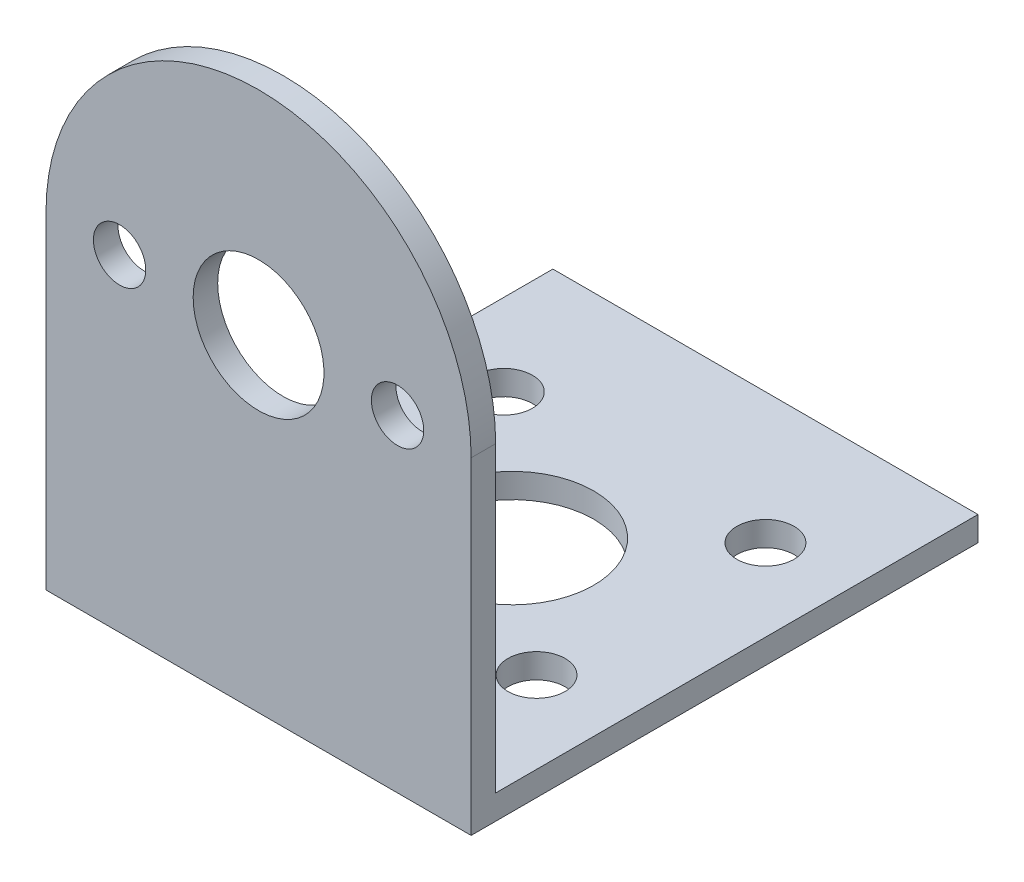
ISO-10303-21;
HEADER;
FILE_DESCRIPTION(('STEP AP214'),'2;1');
FILE_NAME('part.step','',(''),(''),'','','');
FILE_SCHEMA(('AUTOMOTIVE_DESIGN { 1 0 10303 214 1 1 1 1 }'));
ENDSEC;
DATA;
#1=APPLICATION_CONTEXT('core data for automotive mechanical design processes');
#2=APPLICATION_PROTOCOL_DEFINITION('international standard','automotive_design',2000,#1);
#3=PRODUCT_CONTEXT('',#1,'mechanical');
#4=PRODUCT('Part','Part','',(#3));
#5=PRODUCT_RELATED_PRODUCT_CATEGORY('part','',(#4));
#6=PRODUCT_DEFINITION_FORMATION('','',#4);
#7=PRODUCT_DEFINITION_CONTEXT('part definition',#1,'design');
#8=PRODUCT_DEFINITION('design','',#6,#7);
#9=PRODUCT_DEFINITION_SHAPE('','',#8);
#10=(LENGTH_UNIT() NAMED_UNIT(*) SI_UNIT(.MILLI.,.METRE.));
#11=(NAMED_UNIT(*) PLANE_ANGLE_UNIT() SI_UNIT($,.RADIAN.));
#12=(NAMED_UNIT(*) SI_UNIT($,.STERADIAN.) SOLID_ANGLE_UNIT());
#13=UNCERTAINTY_MEASURE_WITH_UNIT(LENGTH_MEASURE(1.E-05),#10,'distance_accuracy_value','');
#14=(GEOMETRIC_REPRESENTATION_CONTEXT(3) GLOBAL_UNCERTAINTY_ASSIGNED_CONTEXT((#13)) GLOBAL_UNIT_ASSIGNED_CONTEXT((#10,
#11,#12)) REPRESENTATION_CONTEXT('',''));
#15=CARTESIAN_POINT('',(0.,0.,0.));
#16=DIRECTION('',(0.,0.,1.));
#17=DIRECTION('',(1.,0.,0.));
#18=AXIS2_PLACEMENT_3D('',#15,#16,#17);
#19=CARTESIAN_POINT('',(0.,1.5,0.));
#20=DIRECTION('',(0.,-1.,0.));
#21=DIRECTION('',(0.,0.,1.));
#22=AXIS2_PLACEMENT_3D('',#19,#20,#21);
#23=PLANE('',#22);
#24=CARTESIAN_POINT('',(-8.,1.5,-7.5));
#25=DIRECTION('',(0.,-1.,0.));
#26=DIRECTION('',(0.,0.,-1.));
#27=AXIS2_PLACEMENT_3D('',#24,#25,#26);
#28=CIRCLE('',#27,1.75);
#29=CARTESIAN_POINT('',(-8.,1.5,-9.25));
#30=VERTEX_POINT('',#29);
#31=EDGE_CURVE('E156',#30,#30,#28,.T.);
#32=ORIENTED_EDGE('',*,*,#31,.T.);
#33=EDGE_LOOP('',(#32));
#34=FACE_BOUND('',#33,.T.);
#35=CARTESIAN_POINT('',(8.,1.5,-7.5));
#36=DIRECTION('',(0.,-1.,0.));
#37=DIRECTION('',(0.,0.,-1.));
#38=AXIS2_PLACEMENT_3D('',#35,#36,#37);
#39=CIRCLE('',#38,1.75);
#40=CARTESIAN_POINT('',(8.,1.5,-9.25));
#41=VERTEX_POINT('',#40);
#42=EDGE_CURVE('E150',#41,#41,#39,.T.);
#43=ORIENTED_EDGE('',*,*,#42,.T.);
#44=EDGE_LOOP('',(#43));
#45=FACE_BOUND('',#44,.T.);
#46=CARTESIAN_POINT('',(8.,1.5,6.5));
#47=DIRECTION('',(0.,-1.,0.));
#48=DIRECTION('',(0.,0.,-1.));
#49=AXIS2_PLACEMENT_3D('',#46,#47,#48);
#50=CIRCLE('',#49,1.75);
#51=CARTESIAN_POINT('',(8.,1.5,4.75));
#52=VERTEX_POINT('',#51);
#53=EDGE_CURVE('E144',#52,#52,#50,.T.);
#54=ORIENTED_EDGE('',*,*,#53,.T.);
#55=EDGE_LOOP('',(#54));
#56=FACE_BOUND('',#55,.T.);
#57=CARTESIAN_POINT('',(-8.,1.5,6.5));
#58=DIRECTION('',(0.,-1.,0.));
#59=DIRECTION('',(0.,0.,-1.));
#60=AXIS2_PLACEMENT_3D('',#57,#58,#59);
#61=CIRCLE('',#60,1.75);
#62=CARTESIAN_POINT('',(-8.,1.5,4.75));
#63=VERTEX_POINT('',#62);
#64=EDGE_CURVE('E139',#63,#63,#61,.T.);
#65=ORIENTED_EDGE('',*,*,#64,.T.);
#66=EDGE_LOOP('',(#65));
#67=FACE_BOUND('',#66,.T.);
#68=CARTESIAN_POINT('',(0.,1.5,0.));
#69=DIRECTION('',(0.,-1.,0.));
#70=DIRECTION('',(0.,0.,-1.));
#71=AXIS2_PLACEMENT_3D('',#68,#69,#70);
#72=CIRCLE('',#71,5.);
#73=CARTESIAN_POINT('',(0.,1.5,-5.));
#74=VERTEX_POINT('',#73);
#75=EDGE_CURVE('E111',#74,#74,#72,.T.);
#76=ORIENTED_EDGE('',*,*,#75,.T.);
#77=EDGE_LOOP('',(#76));
#78=FACE_BOUND('',#77,.T.);
#79=DIRECTION('',(1.,0.,0.));
#80=VECTOR('',#79,1.);
#81=CARTESIAN_POINT('',(0.,1.5,14.));
#82=LINE('',#81,#80);
#83=CARTESIAN_POINT('',(-13.,1.5,14.));
#84=VERTEX_POINT('',#83);
#85=CARTESIAN_POINT('',(13.,1.5,14.));
#86=VERTEX_POINT('',#85);
#87=EDGE_CURVE('E134',#84,#86,#82,.T.);
#88=ORIENTED_EDGE('',*,*,#87,.T.);
#89=DIRECTION('',(0.,0.,1.));
#90=VECTOR('',#89,1.);
#91=CARTESIAN_POINT('',(13.,1.5,-15.5));
#92=LINE('',#91,#90);
#93=CARTESIAN_POINT('',(13.,1.5,-15.5));
#94=VERTEX_POINT('',#93);
#95=EDGE_CURVE('E105',#94,#86,#92,.T.);
#96=ORIENTED_EDGE('',*,*,#95,.F.);
#97=DIRECTION('',(1.,0.,0.));
#98=VECTOR('',#97,1.);
#99=CARTESIAN_POINT('',(-13.,1.5,-15.5));
#100=LINE('',#99,#98);
#101=CARTESIAN_POINT('',(-13.,1.5,-15.5));
#102=VERTEX_POINT('',#101);
#103=EDGE_CURVE('E93',#102,#94,#100,.T.);
#104=ORIENTED_EDGE('',*,*,#103,.F.);
#105=DIRECTION('',(0.,0.,-1.));
#106=VECTOR('',#105,1.);
#107=CARTESIAN_POINT('',(-13.,1.5,-15.5));
#108=LINE('',#107,#106);
#109=EDGE_CURVE('E130',#84,#102,#108,.T.);
#110=ORIENTED_EDGE('',*,*,#109,.F.);
#111=EDGE_LOOP('',(#88,#96,#104,#110));
#112=FACE_BOUND('',#111,.T.);
#113=ADVANCED_FACE('F47',(#34,#45,#56,#67,#78,#112),#23,.F.);
#114=CARTESIAN_POINT('',(0.,0.,0.));
#115=DIRECTION('',(0.,-1.,0.));
#116=DIRECTION('',(0.,0.,1.));
#117=AXIS2_PLACEMENT_3D('',#114,#115,#116);
#118=PLANE('',#117);
#119=CARTESIAN_POINT('',(8.,0.,-7.5));
#120=DIRECTION('',(0.,-1.,0.));
#121=DIRECTION('',(0.,0.,-1.));
#122=AXIS2_PLACEMENT_3D('',#119,#120,#121);
#123=CIRCLE('',#122,1.75);
#124=CARTESIAN_POINT('',(8.,0.,-9.25));
#125=VERTEX_POINT('',#124);
#126=EDGE_CURVE('E153',#125,#125,#123,.T.);
#127=ORIENTED_EDGE('',*,*,#126,.F.);
#128=EDGE_LOOP('',(#127));
#129=FACE_BOUND('',#128,.T.);
#130=CARTESIAN_POINT('',(-8.,0.,6.5));
#131=DIRECTION('',(0.,-1.,0.));
#132=DIRECTION('',(0.,0.,-1.));
#133=AXIS2_PLACEMENT_3D('',#130,#131,#132);
#134=CIRCLE('',#133,1.75);
#135=CARTESIAN_POINT('',(-8.,0.,4.75));
#136=VERTEX_POINT('',#135);
#137=EDGE_CURVE('E141',#136,#136,#134,.T.);
#138=ORIENTED_EDGE('',*,*,#137,.F.);
#139=EDGE_LOOP('',(#138));
#140=FACE_BOUND('',#139,.T.);
#141=DIRECTION('',(0.,0.,1.));
#142=VECTOR('',#141,1.);
#143=CARTESIAN_POINT('',(13.,0.,-15.5));
#144=LINE('',#143,#142);
#145=CARTESIAN_POINT('',(13.,0.,-15.5));
#146=VERTEX_POINT('',#145);
#147=CARTESIAN_POINT('',(13.,0.,15.5));
#148=VERTEX_POINT('',#147);
#149=EDGE_CURVE('E102',#146,#148,#144,.T.);
#150=ORIENTED_EDGE('',*,*,#149,.T.);
#151=DIRECTION('',(-1.,0.,0.));
#152=VECTOR('',#151,1.);
#153=CARTESIAN_POINT('',(-13.,0.,15.5));
#154=LINE('',#153,#152);
#155=CARTESIAN_POINT('',(-13.,0.,15.5));
#156=VERTEX_POINT('',#155);
#157=EDGE_CURVE('E110',#148,#156,#154,.T.);
#158=ORIENTED_EDGE('',*,*,#157,.T.);
#159=DIRECTION('',(0.,0.,-1.));
#160=VECTOR('',#159,1.);
#161=CARTESIAN_POINT('',(-13.,0.,-15.5));
#162=LINE('',#161,#160);
#163=CARTESIAN_POINT('',(-13.,0.,-15.5));
#164=VERTEX_POINT('',#163);
#165=EDGE_CURVE('E104',#156,#164,#162,.T.);
#166=ORIENTED_EDGE('',*,*,#165,.T.);
#167=DIRECTION('',(1.,0.,0.));
#168=VECTOR('',#167,1.);
#169=CARTESIAN_POINT('',(-13.,0.,-15.5));
#170=LINE('',#169,#168);
#171=EDGE_CURVE('E90',#164,#146,#170,.T.);
#172=ORIENTED_EDGE('',*,*,#171,.T.);
#173=EDGE_LOOP('',(#150,#158,#166,#172));
#174=FACE_BOUND('',#173,.T.);
#175=CARTESIAN_POINT('',(0.,0.,0.));
#176=DIRECTION('',(0.,-1.,0.));
#177=DIRECTION('',(0.,0.,-1.));
#178=AXIS2_PLACEMENT_3D('',#175,#176,#177);
#179=CIRCLE('',#178,5.);
#180=CARTESIAN_POINT('',(0.,0.,-5.));
#181=VERTEX_POINT('',#180);
#182=EDGE_CURVE('E115',#181,#181,#179,.T.);
#183=ORIENTED_EDGE('',*,*,#182,.F.);
#184=EDGE_LOOP('',(#183));
#185=FACE_BOUND('',#184,.T.);
#186=CARTESIAN_POINT('',(8.,0.,6.5));
#187=DIRECTION('',(0.,-1.,0.));
#188=DIRECTION('',(0.,0.,-1.));
#189=AXIS2_PLACEMENT_3D('',#186,#187,#188);
#190=CIRCLE('',#189,1.75);
#191=CARTESIAN_POINT('',(8.,0.,4.75));
#192=VERTEX_POINT('',#191);
#193=EDGE_CURVE('E147',#192,#192,#190,.T.);
#194=ORIENTED_EDGE('',*,*,#193,.F.);
#195=EDGE_LOOP('',(#194));
#196=FACE_BOUND('',#195,.T.);
#197=CARTESIAN_POINT('',(-8.,0.,-7.5));
#198=DIRECTION('',(0.,-1.,0.));
#199=DIRECTION('',(0.,0.,-1.));
#200=AXIS2_PLACEMENT_3D('',#197,#198,#199);
#201=CIRCLE('',#200,1.75);
#202=CARTESIAN_POINT('',(-8.,0.,-9.25));
#203=VERTEX_POINT('',#202);
#204=EDGE_CURVE('E159',#203,#203,#201,.T.);
#205=ORIENTED_EDGE('',*,*,#204,.F.);
#206=EDGE_LOOP('',(#205));
#207=FACE_BOUND('',#206,.T.);
#208=ADVANCED_FACE('F99',(#129,#140,#174,#185,#196,#207),#118,.T.);
#209=CARTESIAN_POINT('',(13.,1.5,-15.5));
#210=DIRECTION('',(-1.,0.,0.));
#211=DIRECTION('',(0.,0.,-1.));
#212=AXIS2_PLACEMENT_3D('',#209,#210,#211);
#213=PLANE('',#212);
#214=ORIENTED_EDGE('',*,*,#149,.F.);
#215=DIRECTION('',(0.,-1.,0.));
#216=VECTOR('',#215,1.);
#217=CARTESIAN_POINT('',(13.,1.5,-15.5));
#218=LINE('',#217,#216);
#219=EDGE_CURVE('E71',#94,#146,#218,.T.);
#220=ORIENTED_EDGE('',*,*,#219,.F.);
#221=ORIENTED_EDGE('',*,*,#95,.T.);
#222=DIRECTION('',(0.,1.,0.));
#223=VECTOR('',#222,1.);
#224=CARTESIAN_POINT('',(13.,0.,14.));
#225=LINE('',#224,#223);
#226=CARTESIAN_POINT('',(13.,20.,14.));
#227=VERTEX_POINT('',#226);
#228=EDGE_CURVE('E189',#86,#227,#225,.T.);
#229=ORIENTED_EDGE('',*,*,#228,.T.);
#230=DIRECTION('',(0.,0.,1.));
#231=VECTOR('',#230,1.);
#232=CARTESIAN_POINT('',(13.,20.,14.));
#233=LINE('',#232,#231);
#234=CARTESIAN_POINT('',(13.,20.,15.5));
#235=VERTEX_POINT('',#234);
#236=EDGE_CURVE('E162',#227,#235,#233,.T.);
#237=ORIENTED_EDGE('',*,*,#236,.T.);
#238=DIRECTION('',(0.,-1.,0.));
#239=VECTOR('',#238,1.);
#240=CARTESIAN_POINT('',(13.,1.5,15.5));
#241=LINE('',#240,#239);
#242=EDGE_CURVE('E11',#235,#148,#241,.T.);
#243=ORIENTED_EDGE('',*,*,#242,.T.);
#244=EDGE_LOOP('',(#214,#220,#221,#229,#237,#243));
#245=FACE_BOUND('',#244,.T.);
#246=ADVANCED_FACE('F49',(#245),#213,.F.);
#247=CARTESIAN_POINT('',(-13.,1.5,15.5));
#248=DIRECTION('',(0.,0.,-1.));
#249=DIRECTION('',(1.,0.,0.));
#250=AXIS2_PLACEMENT_3D('',#247,#248,#249);
#251=PLANE('',#250);
#252=ORIENTED_EDGE('',*,*,#157,.F.);
#253=ORIENTED_EDGE('',*,*,#242,.F.);
#254=CARTESIAN_POINT('',(0.,20.,15.5));
#255=DIRECTION('',(0.,0.,-1.));
#256=DIRECTION('',(-1.,0.,0.));
#257=AXIS2_PLACEMENT_3D('',#254,#255,#256);
#258=CIRCLE('',#257,13.);
#259=CARTESIAN_POINT('',(-13.,20.,15.5));
#260=VERTEX_POINT('',#259);
#261=EDGE_CURVE('E128',#260,#235,#258,.T.);
#262=ORIENTED_EDGE('',*,*,#261,.F.);
#263=DIRECTION('',(0.,-1.,0.));
#264=VECTOR('',#263,1.);
#265=CARTESIAN_POINT('',(-13.,1.5,15.5));
#266=LINE('',#265,#264);
#267=EDGE_CURVE('E55',#260,#156,#266,.T.);
#268=ORIENTED_EDGE('',*,*,#267,.T.);
#269=EDGE_LOOP('',(#252,#253,#262,#268));
#270=FACE_BOUND('',#269,.T.);
#271=CARTESIAN_POINT('',(0.,20.,15.5));
#272=DIRECTION('',(0.,0.,-1.));
#273=DIRECTION('',(-1.,0.,0.));
#274=AXIS2_PLACEMENT_3D('',#271,#272,#273);
#275=CIRCLE('',#274,4.);
#276=CARTESIAN_POINT('',(-4.,20.,15.5));
#277=VERTEX_POINT('',#276);
#278=EDGE_CURVE('E176',#277,#277,#275,.T.);
#279=ORIENTED_EDGE('',*,*,#278,.T.);
#280=EDGE_LOOP('',(#279));
#281=FACE_BOUND('',#280,.T.);
#282=CARTESIAN_POINT('',(8.5,20.,15.5));
#283=DIRECTION('',(0.,0.,-1.));
#284=DIRECTION('',(-1.,0.,0.));
#285=AXIS2_PLACEMENT_3D('',#282,#283,#284);
#286=CIRCLE('',#285,1.6);
#287=CARTESIAN_POINT('',(6.9,20.,15.5));
#288=VERTEX_POINT('',#287);
#289=EDGE_CURVE('E173',#288,#288,#286,.T.);
#290=ORIENTED_EDGE('',*,*,#289,.T.);
#291=EDGE_LOOP('',(#290));
#292=FACE_BOUND('',#291,.T.);
#293=CARTESIAN_POINT('',(-8.5,20.,15.5));
#294=DIRECTION('',(0.,0.,-1.));
#295=DIRECTION('',(-1.,0.,0.));
#296=AXIS2_PLACEMENT_3D('',#293,#294,#295);
#297=CIRCLE('',#296,1.6);
#298=CARTESIAN_POINT('',(-10.1,20.,15.5));
#299=VERTEX_POINT('',#298);
#300=EDGE_CURVE('E170',#299,#299,#297,.F.);
#301=ORIENTED_EDGE('',*,*,#300,.F.);
#302=EDGE_LOOP('',(#301));
#303=FACE_BOUND('',#302,.T.);
#304=ADVANCED_FACE('F124',(#270,#281,#292,#303),#251,.F.);
#305=CARTESIAN_POINT('',(-13.,1.5,-15.5));
#306=DIRECTION('',(1.,0.,0.));
#307=DIRECTION('',(0.,0.,1.));
#308=AXIS2_PLACEMENT_3D('',#305,#306,#307);
#309=PLANE('',#308);
#310=ORIENTED_EDGE('',*,*,#165,.F.);
#311=ORIENTED_EDGE('',*,*,#267,.F.);
#312=DIRECTION('',(0.,0.,1.));
#313=VECTOR('',#312,1.);
#314=CARTESIAN_POINT('',(-13.,20.,14.));
#315=LINE('',#314,#313);
#316=CARTESIAN_POINT('',(-13.,20.,14.));
#317=VERTEX_POINT('',#316);
#318=EDGE_CURVE('E165',#317,#260,#315,.T.);
#319=ORIENTED_EDGE('',*,*,#318,.F.);
#320=DIRECTION('',(0.,1.,0.));
#321=VECTOR('',#320,1.);
#322=CARTESIAN_POINT('',(-13.,0.,14.));
#323=LINE('',#322,#321);
#324=EDGE_CURVE('E62',#84,#317,#323,.T.);
#325=ORIENTED_EDGE('',*,*,#324,.F.);
#326=ORIENTED_EDGE('',*,*,#109,.T.);
#327=DIRECTION('',(0.,-1.,0.));
#328=VECTOR('',#327,1.);
#329=CARTESIAN_POINT('',(-13.,1.5,-15.5));
#330=LINE('',#329,#328);
#331=EDGE_CURVE('E95',#102,#164,#330,.T.);
#332=ORIENTED_EDGE('',*,*,#331,.T.);
#333=EDGE_LOOP('',(#310,#311,#319,#325,#326,#332));
#334=FACE_BOUND('',#333,.T.);
#335=ADVANCED_FACE('F129',(#334),#309,.F.);
#336=CARTESIAN_POINT('',(-13.,1.5,-15.5));
#337=DIRECTION('',(0.,0.,1.));
#338=DIRECTION('',(-1.,0.,0.));
#339=AXIS2_PLACEMENT_3D('',#336,#337,#338);
#340=PLANE('',#339);
#341=ORIENTED_EDGE('',*,*,#171,.F.);
#342=ORIENTED_EDGE('',*,*,#331,.F.);
#343=ORIENTED_EDGE('',*,*,#103,.T.);
#344=ORIENTED_EDGE('',*,*,#219,.T.);
#345=EDGE_LOOP('',(#341,#342,#343,#344));
#346=FACE_BOUND('',#345,.T.);
#347=ADVANCED_FACE('F89',(#346),#340,.F.);
#348=CARTESIAN_POINT('',(0.,1.5,0.));
#349=DIRECTION('',(0.,-1.,0.));
#350=DIRECTION('',(0.,0.,1.));
#351=AXIS2_PLACEMENT_3D('',#348,#349,#350);
#352=CYLINDRICAL_SURFACE('',#351,5.);
#353=ORIENTED_EDGE('',*,*,#75,.F.);
#354=EDGE_LOOP('',(#353));
#355=FACE_BOUND('',#354,.T.);
#356=ORIENTED_EDGE('',*,*,#182,.T.);
#357=EDGE_LOOP('',(#356));
#358=FACE_BOUND('',#357,.T.);
#359=ADVANCED_FACE('F233',(#355,#358),#352,.F.);
#360=CARTESIAN_POINT('',(-8.,1.5,6.5));
#361=DIRECTION('',(0.,-1.,0.));
#362=DIRECTION('',(0.,0.,1.));
#363=AXIS2_PLACEMENT_3D('',#360,#361,#362);
#364=CYLINDRICAL_SURFACE('',#363,1.75);
#365=ORIENTED_EDGE('',*,*,#64,.F.);
#366=EDGE_LOOP('',(#365));
#367=FACE_BOUND('',#366,.T.);
#368=ORIENTED_EDGE('',*,*,#137,.T.);
#369=EDGE_LOOP('',(#368));
#370=FACE_BOUND('',#369,.T.);
#371=ADVANCED_FACE('F318',(#367,#370),#364,.F.);
#372=CARTESIAN_POINT('',(8.,1.5,6.5));
#373=DIRECTION('',(0.,-1.,0.));
#374=DIRECTION('',(0.,0.,1.));
#375=AXIS2_PLACEMENT_3D('',#372,#373,#374);
#376=CYLINDRICAL_SURFACE('',#375,1.75);
#377=ORIENTED_EDGE('',*,*,#53,.F.);
#378=EDGE_LOOP('',(#377));
#379=FACE_BOUND('',#378,.T.);
#380=ORIENTED_EDGE('',*,*,#193,.T.);
#381=EDGE_LOOP('',(#380));
#382=FACE_BOUND('',#381,.T.);
#383=ADVANCED_FACE('F309',(#379,#382),#376,.F.);
#384=CARTESIAN_POINT('',(8.,1.5,-7.5));
#385=DIRECTION('',(0.,-1.,0.));
#386=DIRECTION('',(0.,0.,1.));
#387=AXIS2_PLACEMENT_3D('',#384,#385,#386);
#388=CYLINDRICAL_SURFACE('',#387,1.75);
#389=ORIENTED_EDGE('',*,*,#42,.F.);
#390=EDGE_LOOP('',(#389));
#391=FACE_BOUND('',#390,.T.);
#392=ORIENTED_EDGE('',*,*,#126,.T.);
#393=EDGE_LOOP('',(#392));
#394=FACE_BOUND('',#393,.T.);
#395=ADVANCED_FACE('F301',(#391,#394),#388,.F.);
#396=CARTESIAN_POINT('',(-8.,1.5,-7.5));
#397=DIRECTION('',(0.,-1.,0.));
#398=DIRECTION('',(0.,0.,1.));
#399=AXIS2_PLACEMENT_3D('',#396,#397,#398);
#400=CYLINDRICAL_SURFACE('',#399,1.75);
#401=ORIENTED_EDGE('',*,*,#31,.F.);
#402=EDGE_LOOP('',(#401));
#403=FACE_BOUND('',#402,.T.);
#404=ORIENTED_EDGE('',*,*,#204,.T.);
#405=EDGE_LOOP('',(#404));
#406=FACE_BOUND('',#405,.T.);
#407=ADVANCED_FACE('F271',(#403,#406),#400,.F.);
#408=CARTESIAN_POINT('',(8.5,20.,14.));
#409=DIRECTION('',(0.,0.,1.));
#410=DIRECTION('',(-1.,0.,0.));
#411=AXIS2_PLACEMENT_3D('',#408,#409,#410);
#412=CYLINDRICAL_SURFACE('',#411,1.6);
#413=CARTESIAN_POINT('',(8.5,20.,14.));
#414=DIRECTION('',(0.,0.,-1.));
#415=DIRECTION('',(-1.,0.,0.));
#416=AXIS2_PLACEMENT_3D('',#413,#414,#415);
#417=CIRCLE('',#416,1.6);
#418=CARTESIAN_POINT('',(6.9,20.,14.));
#419=VERTEX_POINT('',#418);
#420=EDGE_CURVE('E182',#419,#419,#417,.T.);
#421=ORIENTED_EDGE('',*,*,#420,.T.);
#422=EDGE_LOOP('',(#421));
#423=FACE_BOUND('',#422,.T.);
#424=ORIENTED_EDGE('',*,*,#289,.F.);
#425=EDGE_LOOP('',(#424));
#426=FACE_BOUND('',#425,.T.);
#427=ADVANCED_FACE('F219',(#423,#426),#412,.F.);
#428=CARTESIAN_POINT('',(0.,20.,14.));
#429=DIRECTION('',(0.,0.,1.));
#430=DIRECTION('',(-1.,0.,0.));
#431=AXIS2_PLACEMENT_3D('',#428,#429,#430);
#432=CYLINDRICAL_SURFACE('',#431,4.);
#433=CARTESIAN_POINT('',(0.,20.,14.));
#434=DIRECTION('',(0.,0.,-1.));
#435=DIRECTION('',(-1.,0.,0.));
#436=AXIS2_PLACEMENT_3D('',#433,#434,#435);
#437=CIRCLE('',#436,4.);
#438=CARTESIAN_POINT('',(-4.,20.,14.));
#439=VERTEX_POINT('',#438);
#440=EDGE_CURVE('E185',#439,#439,#437,.T.);
#441=ORIENTED_EDGE('',*,*,#440,.T.);
#442=EDGE_LOOP('',(#441));
#443=FACE_BOUND('',#442,.T.);
#444=ORIENTED_EDGE('',*,*,#278,.F.);
#445=EDGE_LOOP('',(#444));
#446=FACE_BOUND('',#445,.T.);
#447=ADVANCED_FACE('F211',(#443,#446),#432,.F.);
#448=CARTESIAN_POINT('',(0.,20.,14.));
#449=DIRECTION('',(0.,0.,1.));
#450=DIRECTION('',(-1.,0.,0.));
#451=AXIS2_PLACEMENT_3D('',#448,#449,#450);
#452=CYLINDRICAL_SURFACE('',#451,13.);
#453=ORIENTED_EDGE('',*,*,#261,.T.);
#454=ORIENTED_EDGE('',*,*,#236,.F.);
#455=CARTESIAN_POINT('',(0.,20.,14.));
#456=DIRECTION('',(0.,0.,-1.));
#457=DIRECTION('',(-1.,0.,0.));
#458=AXIS2_PLACEMENT_3D('',#455,#456,#457);
#459=CIRCLE('',#458,13.);
#460=EDGE_CURVE('E191',#317,#227,#459,.T.);
#461=ORIENTED_EDGE('',*,*,#460,.F.);
#462=ORIENTED_EDGE('',*,*,#318,.T.);
#463=EDGE_LOOP('',(#453,#454,#461,#462));
#464=FACE_BOUND('',#463,.T.);
#465=ADVANCED_FACE('F205',(#464),#452,.T.);
#466=CARTESIAN_POINT('',(-8.5,20.,14.));
#467=DIRECTION('',(0.,0.,1.));
#468=DIRECTION('',(-1.,0.,0.));
#469=AXIS2_PLACEMENT_3D('',#466,#467,#468);
#470=CYLINDRICAL_SURFACE('',#469,1.6);
#471=CARTESIAN_POINT('',(-8.5,20.,14.));
#472=DIRECTION('',(0.,0.,-1.));
#473=DIRECTION('',(-1.,0.,0.));
#474=AXIS2_PLACEMENT_3D('',#471,#472,#473);
#475=CIRCLE('',#474,1.6);
#476=CARTESIAN_POINT('',(-10.1,20.,14.));
#477=VERTEX_POINT('',#476);
#478=EDGE_CURVE('E168',#477,#477,#475,.F.);
#479=ORIENTED_EDGE('',*,*,#478,.F.);
#480=EDGE_LOOP('',(#479));
#481=FACE_BOUND('',#480,.T.);
#482=ORIENTED_EDGE('',*,*,#300,.T.);
#483=EDGE_LOOP('',(#482));
#484=FACE_BOUND('',#483,.T.);
#485=ADVANCED_FACE('F210',(#481,#484),#470,.F.);
#486=CARTESIAN_POINT('',(0.,0.,14.));
#487=DIRECTION('',(0.,0.,1.));
#488=DIRECTION('',(-1.,0.,0.));
#489=AXIS2_PLACEMENT_3D('',#486,#487,#488);
#490=PLANE('',#489);
#491=ORIENTED_EDGE('',*,*,#324,.T.);
#492=ORIENTED_EDGE('',*,*,#460,.T.);
#493=ORIENTED_EDGE('',*,*,#228,.F.);
#494=ORIENTED_EDGE('',*,*,#87,.F.);
#495=EDGE_LOOP('',(#491,#492,#493,#494));
#496=FACE_BOUND('',#495,.T.);
#497=ORIENTED_EDGE('',*,*,#440,.F.);
#498=EDGE_LOOP('',(#497));
#499=FACE_BOUND('',#498,.T.);
#500=ORIENTED_EDGE('',*,*,#420,.F.);
#501=EDGE_LOOP('',(#500));
#502=FACE_BOUND('',#501,.T.);
#503=ORIENTED_EDGE('',*,*,#478,.T.);
#504=EDGE_LOOP('',(#503));
#505=FACE_BOUND('',#504,.T.);
#506=ADVANCED_FACE('F196',(#496,#499,#502,#505),#490,.F.);
#507=CLOSED_SHELL('',(#113,#208,#246,#304,#335,#347,#359,#371,#383,#395,#407,#427,#447,#465,
#485,#506));
#508=MANIFOLD_SOLID_BREP('B2',#507);
#509=ADVANCED_BREP_SHAPE_REPRESENTATION('',(#18,#508),#14);
#510=SHAPE_DEFINITION_REPRESENTATION(#9,#509);
ENDSEC;
END-ISO-10303-21;
